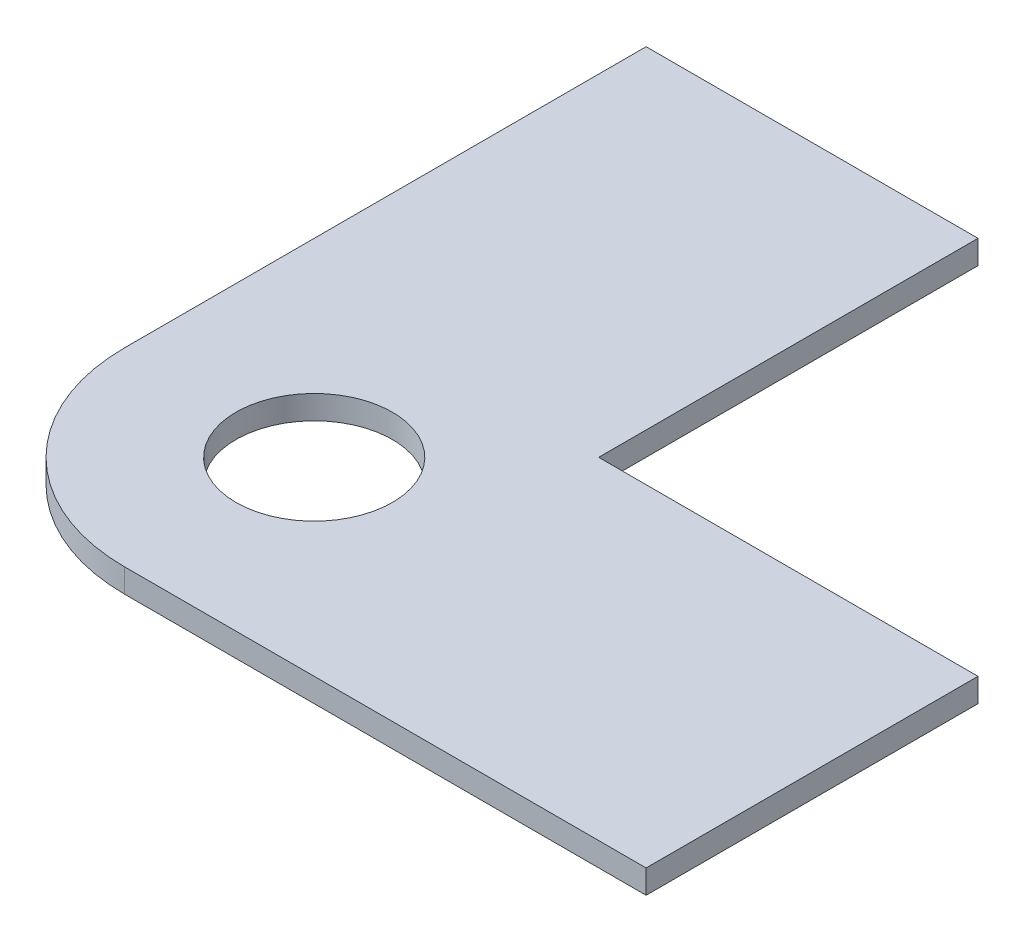
ISO-10303-21;
HEADER;
FILE_DESCRIPTION(('STEP AP214'),'2;1');
FILE_NAME('part.step','',(''),(''),'','','');
FILE_SCHEMA(('AUTOMOTIVE_DESIGN { 1 0 10303 214 1 1 1 1 }'));
ENDSEC;
DATA;
#1=APPLICATION_CONTEXT('core data for automotive mechanical design processes');
#2=APPLICATION_PROTOCOL_DEFINITION('international standard','automotive_design',2000,#1);
#3=PRODUCT_CONTEXT('',#1,'mechanical');
#4=PRODUCT('Part','Part','',(#3));
#5=PRODUCT_RELATED_PRODUCT_CATEGORY('part','',(#4));
#6=PRODUCT_DEFINITION_FORMATION('','',#4);
#7=PRODUCT_DEFINITION_CONTEXT('part definition',#1,'design');
#8=PRODUCT_DEFINITION('design','',#6,#7);
#9=PRODUCT_DEFINITION_SHAPE('','',#8);
#10=(LENGTH_UNIT() NAMED_UNIT(*) SI_UNIT(.MILLI.,.METRE.));
#11=(NAMED_UNIT(*) PLANE_ANGLE_UNIT() SI_UNIT($,.RADIAN.));
#12=(NAMED_UNIT(*) SI_UNIT($,.STERADIAN.) SOLID_ANGLE_UNIT());
#13=UNCERTAINTY_MEASURE_WITH_UNIT(LENGTH_MEASURE(1.E-05),#10,'distance_accuracy_value','');
#14=(GEOMETRIC_REPRESENTATION_CONTEXT(3) GLOBAL_UNCERTAINTY_ASSIGNED_CONTEXT((#13)) GLOBAL_UNIT_ASSIGNED_CONTEXT((#10,
#11,#12)) REPRESENTATION_CONTEXT('',''));
#15=CARTESIAN_POINT('',(0.,0.,0.));
#16=DIRECTION('',(0.,0.,1.));
#17=DIRECTION('',(1.,0.,0.));
#18=AXIS2_PLACEMENT_3D('',#15,#16,#17);
#19=CARTESIAN_POINT('',(0.,0.5,3.99967418048264));
#20=DIRECTION('',(0.,0.,-1.));
#21=DIRECTION('',(-1.,0.,0.));
#22=AXIS2_PLACEMENT_3D('',#19,#20,#21);
#23=PLANE('',#22);
#24=DIRECTION('',(1.,0.,0.));
#25=VECTOR('',#24,1.);
#26=CARTESIAN_POINT('',(0.,0.,3.99967418048264));
#27=LINE('',#26,#25);
#28=CARTESIAN_POINT('',(0.,0.,3.99967418048264));
#29=VERTEX_POINT('',#28);
#30=CARTESIAN_POINT('',(11.,0.,3.99967418048264));
#31=VERTEX_POINT('',#30);
#32=EDGE_CURVE('E142',#29,#31,#27,.T.);
#33=ORIENTED_EDGE('',*,*,#32,.T.);
#34=DIRECTION('',(0.,-1.,0.));
#35=VECTOR('',#34,1.);
#36=CARTESIAN_POINT('',(11.,0.5,3.99967418048264));
#37=LINE('',#36,#35);
#38=CARTESIAN_POINT('',(11.,0.5,3.99967418048264));
#39=VERTEX_POINT('',#38);
#40=EDGE_CURVE('E11',#39,#31,#37,.T.);
#41=ORIENTED_EDGE('',*,*,#40,.F.);
#42=DIRECTION('',(1.,0.,0.));
#43=VECTOR('',#42,1.);
#44=CARTESIAN_POINT('',(0.,0.5,3.99967418048264));
#45=LINE('',#44,#43);
#46=CARTESIAN_POINT('',(0.,0.5,3.99967418048264));
#47=VERTEX_POINT('',#46);
#48=EDGE_CURVE('E170',#47,#39,#45,.T.);
#49=ORIENTED_EDGE('',*,*,#48,.F.);
#50=DIRECTION('',(0.,-1.,0.));
#51=VECTOR('',#50,1.);
#52=CARTESIAN_POINT('',(0.,0.5,3.99967418048264));
#53=LINE('',#52,#51);
#54=EDGE_CURVE('E58',#47,#29,#53,.T.);
#55=ORIENTED_EDGE('',*,*,#54,.T.);
#56=EDGE_LOOP('',(#33,#41,#49,#55));
#57=FACE_BOUND('',#56,.T.);
#58=ADVANCED_FACE('F41',(#57),#23,.F.);
#59=CARTESIAN_POINT('',(11.,0.5,0.));
#60=DIRECTION('',(-1.,0.,0.));
#61=DIRECTION('',(0.,0.,1.));
#62=AXIS2_PLACEMENT_3D('',#59,#60,#61);
#63=PLANE('',#62);
#64=DIRECTION('',(0.,0.,-1.));
#65=VECTOR('',#64,1.);
#66=CARTESIAN_POINT('',(11.,0.,0.));
#67=LINE('',#66,#65);
#68=CARTESIAN_POINT('',(11.,0.,-3.));
#69=VERTEX_POINT('',#68);
#70=EDGE_CURVE('E145',#31,#69,#67,.T.);
#71=ORIENTED_EDGE('',*,*,#70,.T.);
#72=DIRECTION('',(0.,-1.,0.));
#73=VECTOR('',#72,1.);
#74=CARTESIAN_POINT('',(11.,0.5,-3.));
#75=LINE('',#74,#73);
#76=CARTESIAN_POINT('',(11.,0.5,-3.));
#77=VERTEX_POINT('',#76);
#78=EDGE_CURVE('E50',#77,#69,#75,.T.);
#79=ORIENTED_EDGE('',*,*,#78,.F.);
#80=DIRECTION('',(0.,0.,-1.));
#81=VECTOR('',#80,1.);
#82=CARTESIAN_POINT('',(11.,0.5,0.));
#83=LINE('',#82,#81);
#84=EDGE_CURVE('E93',#39,#77,#83,.T.);
#85=ORIENTED_EDGE('',*,*,#84,.F.);
#86=ORIENTED_EDGE('',*,*,#40,.T.);
#87=EDGE_LOOP('',(#71,#79,#85,#86));
#88=FACE_BOUND('',#87,.T.);
#89=ADVANCED_FACE('F185',(#88),#63,.F.);
#90=CARTESIAN_POINT('',(0.,0.5,-3.));
#91=DIRECTION('',(0.,0.,-1.));
#92=DIRECTION('',(-1.,0.,0.));
#93=AXIS2_PLACEMENT_3D('',#90,#91,#92);
#94=PLANE('',#93);
#95=DIRECTION('',(1.,0.,0.));
#96=VECTOR('',#95,1.);
#97=CARTESIAN_POINT('',(0.,0.,-3.));
#98=LINE('',#97,#96);
#99=CARTESIAN_POINT('',(3.,0.,-3.));
#100=VERTEX_POINT('',#99);
#101=EDGE_CURVE('E149',#100,#69,#98,.T.);
#102=ORIENTED_EDGE('',*,*,#101,.F.);
#103=DIRECTION('',(0.,-1.,0.));
#104=VECTOR('',#103,1.);
#105=CARTESIAN_POINT('',(3.,0.5,-3.));
#106=LINE('',#105,#104);
#107=CARTESIAN_POINT('',(3.,0.5,-3.));
#108=VERTEX_POINT('',#107);
#109=EDGE_CURVE('E177',#108,#100,#106,.T.);
#110=ORIENTED_EDGE('',*,*,#109,.F.);
#111=DIRECTION('',(1.,0.,0.));
#112=VECTOR('',#111,1.);
#113=CARTESIAN_POINT('',(0.,0.5,-3.));
#114=LINE('',#113,#112);
#115=EDGE_CURVE('E184',#108,#77,#114,.T.);
#116=ORIENTED_EDGE('',*,*,#115,.T.);
#117=ORIENTED_EDGE('',*,*,#78,.T.);
#118=EDGE_LOOP('',(#102,#110,#116,#117));
#119=FACE_BOUND('',#118,.T.);
#120=ADVANCED_FACE('F183',(#119),#94,.T.);
#121=CARTESIAN_POINT('',(3.,0.5,0.));
#122=DIRECTION('',(1.,0.,0.));
#123=DIRECTION('',(0.,0.,-1.));
#124=AXIS2_PLACEMENT_3D('',#121,#122,#123);
#125=PLANE('',#124);
#126=DIRECTION('',(0.,0.,1.));
#127=VECTOR('',#126,1.);
#128=CARTESIAN_POINT('',(3.,0.,0.));
#129=LINE('',#128,#127);
#130=CARTESIAN_POINT('',(3.,0.,-11.));
#131=VERTEX_POINT('',#130);
#132=EDGE_CURVE('E153',#131,#100,#129,.T.);
#133=ORIENTED_EDGE('',*,*,#132,.F.);
#134=DIRECTION('',(0.,-1.,0.));
#135=VECTOR('',#134,1.);
#136=CARTESIAN_POINT('',(3.,0.5,-11.));
#137=LINE('',#136,#135);
#138=CARTESIAN_POINT('',(3.,0.5,-11.));
#139=VERTEX_POINT('',#138);
#140=EDGE_CURVE('E116',#139,#131,#137,.T.);
#141=ORIENTED_EDGE('',*,*,#140,.F.);
#142=DIRECTION('',(0.,0.,1.));
#143=VECTOR('',#142,1.);
#144=CARTESIAN_POINT('',(3.,0.5,0.));
#145=LINE('',#144,#143);
#146=EDGE_CURVE('E127',#139,#108,#145,.T.);
#147=ORIENTED_EDGE('',*,*,#146,.T.);
#148=ORIENTED_EDGE('',*,*,#109,.T.);
#149=EDGE_LOOP('',(#133,#141,#147,#148));
#150=FACE_BOUND('',#149,.T.);
#151=ADVANCED_FACE('F192',(#150),#125,.T.);
#152=CARTESIAN_POINT('',(0.,0.5,-11.));
#153=DIRECTION('',(0.,0.,-1.));
#154=DIRECTION('',(-1.,0.,0.));
#155=AXIS2_PLACEMENT_3D('',#152,#153,#154);
#156=PLANE('',#155);
#157=DIRECTION('',(1.,0.,0.));
#158=VECTOR('',#157,1.);
#159=CARTESIAN_POINT('',(0.,0.,-11.));
#160=LINE('',#159,#158);
#161=CARTESIAN_POINT('',(-3.99967418048264,0.,-11.));
#162=VERTEX_POINT('',#161);
#163=EDGE_CURVE('E111',#162,#131,#160,.T.);
#164=ORIENTED_EDGE('',*,*,#163,.F.);
#165=DIRECTION('',(0.,-1.,0.));
#166=VECTOR('',#165,1.);
#167=CARTESIAN_POINT('',(-3.99967418048264,0.5,-11.));
#168=LINE('',#167,#166);
#169=CARTESIAN_POINT('',(-3.99967418048264,0.5,-11.));
#170=VERTEX_POINT('',#169);
#171=EDGE_CURVE('E106',#170,#162,#168,.T.);
#172=ORIENTED_EDGE('',*,*,#171,.F.);
#173=DIRECTION('',(1.,0.,0.));
#174=VECTOR('',#173,1.);
#175=CARTESIAN_POINT('',(0.,0.5,-11.));
#176=LINE('',#175,#174);
#177=EDGE_CURVE('E109',#170,#139,#176,.T.);
#178=ORIENTED_EDGE('',*,*,#177,.T.);
#179=ORIENTED_EDGE('',*,*,#140,.T.);
#180=EDGE_LOOP('',(#164,#172,#178,#179));
#181=FACE_BOUND('',#180,.T.);
#182=ADVANCED_FACE('F108',(#181),#156,.T.);
#183=CARTESIAN_POINT('',(-3.99967418048264,0.5,0.));
#184=DIRECTION('',(-1.,0.,0.));
#185=DIRECTION('',(0.,0.,1.));
#186=AXIS2_PLACEMENT_3D('',#183,#184,#185);
#187=PLANE('',#186);
#188=DIRECTION('',(0.,0.,-1.));
#189=VECTOR('',#188,1.);
#190=CARTESIAN_POINT('',(-3.99967418048264,0.,0.));
#191=LINE('',#190,#189);
#192=CARTESIAN_POINT('',(-3.99967418048264,0.,0.));
#193=VERTEX_POINT('',#192);
#194=EDGE_CURVE('E159',#193,#162,#191,.T.);
#195=ORIENTED_EDGE('',*,*,#194,.F.);
#196=DIRECTION('',(0.,-1.,0.));
#197=VECTOR('',#196,1.);
#198=CARTESIAN_POINT('',(-3.99967418048264,0.5,0.));
#199=LINE('',#198,#197);
#200=CARTESIAN_POINT('',(-3.99967418048264,0.5,0.));
#201=VERTEX_POINT('',#200);
#202=EDGE_CURVE('E81',#201,#193,#199,.T.);
#203=ORIENTED_EDGE('',*,*,#202,.F.);
#204=DIRECTION('',(0.,0.,-1.));
#205=VECTOR('',#204,1.);
#206=CARTESIAN_POINT('',(-3.99967418048264,0.5,0.));
#207=LINE('',#206,#205);
#208=EDGE_CURVE('E124',#201,#170,#207,.T.);
#209=ORIENTED_EDGE('',*,*,#208,.T.);
#210=ORIENTED_EDGE('',*,*,#171,.T.);
#211=EDGE_LOOP('',(#195,#203,#209,#210));
#212=FACE_BOUND('',#211,.T.);
#213=ADVANCED_FACE('F130',(#212),#187,.T.);
#214=CARTESIAN_POINT('',(0.,0.5,0.));
#215=DIRECTION('',(0.,-1.,0.));
#216=DIRECTION('',(0.,0.,-1.));
#217=AXIS2_PLACEMENT_3D('',#214,#215,#216);
#218=CYLINDRICAL_SURFACE('',#217,3.99967418048264);
#219=CARTESIAN_POINT('',(0.,0.,0.));
#220=DIRECTION('',(0.,1.,0.));
#221=DIRECTION('',(0.,0.,1.));
#222=AXIS2_PLACEMENT_3D('',#219,#220,#221);
#223=CIRCLE('',#222,3.99967418048264);
#224=EDGE_CURVE('E162',#29,#193,#223,.F.);
#225=ORIENTED_EDGE('',*,*,#224,.F.);
#226=ORIENTED_EDGE('',*,*,#54,.F.);
#227=CARTESIAN_POINT('',(0.,0.5,0.));
#228=DIRECTION('',(0.,1.,0.));
#229=DIRECTION('',(0.,0.,1.));
#230=AXIS2_PLACEMENT_3D('',#227,#228,#229);
#231=CIRCLE('',#230,3.99967418048264);
#232=EDGE_CURVE('E132',#47,#201,#231,.F.);
#233=ORIENTED_EDGE('',*,*,#232,.T.);
#234=ORIENTED_EDGE('',*,*,#202,.T.);
#235=EDGE_LOOP('',(#225,#226,#233,#234));
#236=FACE_BOUND('',#235,.T.);
#237=ADVANCED_FACE('F200',(#236),#218,.T.);
#238=CARTESIAN_POINT('',(0.,0.5,0.));
#239=DIRECTION('',(0.,-1.,0.));
#240=DIRECTION('',(0.,0.,-1.));
#241=AXIS2_PLACEMENT_3D('',#238,#239,#240);
#242=CYLINDRICAL_SURFACE('',#241,1.65);
#243=CARTESIAN_POINT('',(0.,0.5,0.));
#244=DIRECTION('',(0.,1.,0.));
#245=DIRECTION('',(0.,0.,1.));
#246=AXIS2_PLACEMENT_3D('',#243,#244,#245);
#247=CIRCLE('',#246,1.65);
#248=CARTESIAN_POINT('',(0.,0.5,1.65));
#249=VERTEX_POINT('',#248);
#250=EDGE_CURVE('E135',#249,#249,#247,.T.);
#251=ORIENTED_EDGE('',*,*,#250,.T.);
#252=EDGE_LOOP('',(#251));
#253=FACE_BOUND('',#252,.T.);
#254=CARTESIAN_POINT('',(0.,0.,0.));
#255=DIRECTION('',(0.,1.,0.));
#256=DIRECTION('',(0.,0.,1.));
#257=AXIS2_PLACEMENT_3D('',#254,#255,#256);
#258=CIRCLE('',#257,1.65);
#259=CARTESIAN_POINT('',(0.,0.,1.65));
#260=VERTEX_POINT('',#259);
#261=EDGE_CURVE('E166',#260,#260,#258,.T.);
#262=ORIENTED_EDGE('',*,*,#261,.F.);
#263=EDGE_LOOP('',(#262));
#264=FACE_BOUND('',#263,.T.);
#265=ADVANCED_FACE('F202',(#253,#264),#242,.F.);
#266=CARTESIAN_POINT('',(0.,0.5,0.));
#267=DIRECTION('',(0.,1.,0.));
#268=DIRECTION('',(0.,0.,1.));
#269=AXIS2_PLACEMENT_3D('',#266,#267,#268);
#270=PLANE('',#269);
#271=ORIENTED_EDGE('',*,*,#48,.T.);
#272=ORIENTED_EDGE('',*,*,#84,.T.);
#273=ORIENTED_EDGE('',*,*,#115,.F.);
#274=ORIENTED_EDGE('',*,*,#146,.F.);
#275=ORIENTED_EDGE('',*,*,#177,.F.);
#276=ORIENTED_EDGE('',*,*,#208,.F.);
#277=ORIENTED_EDGE('',*,*,#232,.F.);
#278=EDGE_LOOP('',(#271,#272,#273,#274,#275,#276,#277));
#279=FACE_BOUND('',#278,.T.);
#280=ORIENTED_EDGE('',*,*,#250,.F.);
#281=EDGE_LOOP('',(#280));
#282=FACE_BOUND('',#281,.T.);
#283=ADVANCED_FACE('F121',(#279,#282),#270,.T.);
#284=CARTESIAN_POINT('',(0.,0.,0.));
#285=DIRECTION('',(0.,1.,0.));
#286=DIRECTION('',(0.,0.,1.));
#287=AXIS2_PLACEMENT_3D('',#284,#285,#286);
#288=PLANE('',#287);
#289=ORIENTED_EDGE('',*,*,#32,.F.);
#290=ORIENTED_EDGE('',*,*,#224,.T.);
#291=ORIENTED_EDGE('',*,*,#194,.T.);
#292=ORIENTED_EDGE('',*,*,#163,.T.);
#293=ORIENTED_EDGE('',*,*,#132,.T.);
#294=ORIENTED_EDGE('',*,*,#101,.T.);
#295=ORIENTED_EDGE('',*,*,#70,.F.);
#296=EDGE_LOOP('',(#289,#290,#291,#292,#293,#294,#295));
#297=FACE_BOUND('',#296,.T.);
#298=ORIENTED_EDGE('',*,*,#261,.T.);
#299=EDGE_LOOP('',(#298));
#300=FACE_BOUND('',#299,.T.);
#301=ADVANCED_FACE('F188',(#297,#300),#288,.F.);
#302=CLOSED_SHELL('',(#58,#89,#120,#151,#182,#213,#237,#265,#283,#301));
#303=MANIFOLD_SOLID_BREP('B2',#302);
#304=ADVANCED_BREP_SHAPE_REPRESENTATION('',(#18,#303),#14);
#305=SHAPE_DEFINITION_REPRESENTATION(#9,#304);
ENDSEC;
END-ISO-10303-21;
